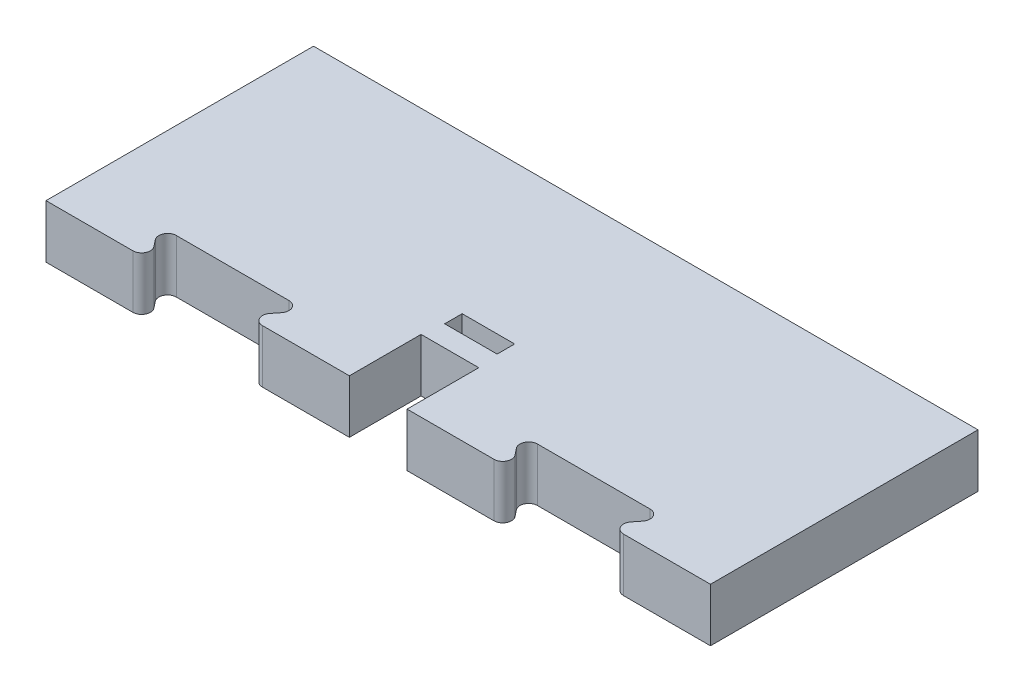
ISO-10303-21;
HEADER;
FILE_DESCRIPTION(('STEP AP214'),'2;1');
FILE_NAME('part.step','',(''),(''),'','','');
FILE_SCHEMA(('AUTOMOTIVE_DESIGN { 1 0 10303 214 1 1 1 1 }'));
ENDSEC;
DATA;
#1=APPLICATION_CONTEXT('core data for automotive mechanical design processes');
#2=APPLICATION_PROTOCOL_DEFINITION('international standard','automotive_design',2000,#1);
#3=PRODUCT_CONTEXT('',#1,'mechanical');
#4=PRODUCT('Part','Part','',(#3));
#5=PRODUCT_RELATED_PRODUCT_CATEGORY('part','',(#4));
#6=PRODUCT_DEFINITION_FORMATION('','',#4);
#7=PRODUCT_DEFINITION_CONTEXT('part definition',#1,'design');
#8=PRODUCT_DEFINITION('design','',#6,#7);
#9=PRODUCT_DEFINITION_SHAPE('','',#8);
#10=(LENGTH_UNIT() NAMED_UNIT(*) SI_UNIT(.MILLI.,.METRE.));
#11=(NAMED_UNIT(*) PLANE_ANGLE_UNIT() SI_UNIT($,.RADIAN.));
#12=(NAMED_UNIT(*) SI_UNIT($,.STERADIAN.) SOLID_ANGLE_UNIT());
#13=UNCERTAINTY_MEASURE_WITH_UNIT(LENGTH_MEASURE(1.E-05),#10,'distance_accuracy_value','');
#14=(GEOMETRIC_REPRESENTATION_CONTEXT(3) GLOBAL_UNCERTAINTY_ASSIGNED_CONTEXT((#13)) GLOBAL_UNIT_ASSIGNED_CONTEXT((#10,
#11,#12)) REPRESENTATION_CONTEXT('',''));
#15=CARTESIAN_POINT('',(0.,0.,0.));
#16=DIRECTION('',(0.,0.,1.));
#17=DIRECTION('',(1.,0.,0.));
#18=AXIS2_PLACEMENT_3D('',#15,#16,#17);
#19=CARTESIAN_POINT('',(0.,3.05,0.));
#20=DIRECTION('',(0.,0.,-1.));
#21=DIRECTION('',(-1.,0.,0.));
#22=AXIS2_PLACEMENT_3D('',#19,#20,#21);
#23=PLANE('',#22);
#24=DIRECTION('',(1.,0.,0.));
#25=VECTOR('',#24,1.);
#26=CARTESIAN_POINT('',(0.,3.05,0.));
#27=LINE('',#26,#25);
#28=CARTESIAN_POINT('',(12.3801767927264,3.05,0.));
#29=VERTEX_POINT('',#28);
#30=CARTESIAN_POINT('',(17.35,3.05,0.));
#31=VERTEX_POINT('',#30);
#32=EDGE_CURVE('E360',#29,#31,#27,.T.);
#33=ORIENTED_EDGE('',*,*,#32,.F.);
#34=DIRECTION('',(0.,1.,0.));
#35=VECTOR('',#34,1.);
#36=CARTESIAN_POINT('',(12.3801767927264,0.,0.));
#37=LINE('',#36,#35);
#38=CARTESIAN_POINT('',(12.3801767927264,0.,0.));
#39=VERTEX_POINT('',#38);
#40=EDGE_CURVE('E421',#29,#39,#37,.F.);
#41=ORIENTED_EDGE('',*,*,#40,.T.);
#42=DIRECTION('',(1.,0.,0.));
#43=VECTOR('',#42,1.);
#44=CARTESIAN_POINT('',(0.,0.,0.));
#45=LINE('',#44,#43);
#46=CARTESIAN_POINT('',(17.35,0.,0.));
#47=VERTEX_POINT('',#46);
#48=EDGE_CURVE('E365',#39,#47,#45,.T.);
#49=ORIENTED_EDGE('',*,*,#48,.T.);
#50=DIRECTION('',(0.,1.,0.));
#51=VECTOR('',#50,1.);
#52=CARTESIAN_POINT('',(17.35,0.,0.));
#53=LINE('',#52,#51);
#54=EDGE_CURVE('E315',#47,#31,#53,.T.);
#55=ORIENTED_EDGE('',*,*,#54,.T.);
#56=EDGE_LOOP('',(#33,#41,#49,#55));
#57=FACE_BOUND('',#56,.T.);
#58=ADVANCED_FACE('F41',(#57),#23,.F.);
#59=CARTESIAN_POINT('',(0.,0.,0.));
#60=VERTEX_POINT('',#59);
#61=CARTESIAN_POINT('',(4.96982320727361,0.,0.));
#62=VERTEX_POINT('',#61);
#63=EDGE_CURVE('E238',#60,#62,#45,.T.);
#64=ORIENTED_EDGE('',*,*,#63,.T.);
#65=DIRECTION('',(0.,1.,0.));
#66=VECTOR('',#65,1.);
#67=CARTESIAN_POINT('',(4.96982320727361,3.05,0.));
#68=LINE('',#67,#66);
#69=CARTESIAN_POINT('',(4.96982320727361,3.05,0.));
#70=VERTEX_POINT('',#69);
#71=EDGE_CURVE('E423',#62,#70,#68,.T.);
#72=ORIENTED_EDGE('',*,*,#71,.T.);
#73=CARTESIAN_POINT('',(0.,3.05,0.));
#74=VERTEX_POINT('',#73);
#75=EDGE_CURVE('E356',#74,#70,#27,.T.);
#76=ORIENTED_EDGE('',*,*,#75,.F.);
#77=DIRECTION('',(0.,-1.,0.));
#78=VECTOR('',#77,1.);
#79=CARTESIAN_POINT('',(0.,3.05,0.));
#80=LINE('',#79,#78);
#81=EDGE_CURVE('E369',#74,#60,#80,.T.);
#82=ORIENTED_EDGE('',*,*,#81,.T.);
#83=EDGE_LOOP('',(#64,#72,#76,#82));
#84=FACE_BOUND('',#83,.T.);
#85=ADVANCED_FACE('F456',(#84),#23,.F.);
#86=CARTESIAN_POINT('',(33.0301767927264,3.05,0.));
#87=VERTEX_POINT('',#86);
#88=CARTESIAN_POINT('',(38.,3.05,0.));
#89=VERTEX_POINT('',#88);
#90=EDGE_CURVE('E355',#87,#89,#27,.T.);
#91=ORIENTED_EDGE('',*,*,#90,.F.);
#92=DIRECTION('',(0.,1.,0.));
#93=VECTOR('',#92,1.);
#94=CARTESIAN_POINT('',(33.0301767927264,0.,0.));
#95=LINE('',#94,#93);
#96=CARTESIAN_POINT('',(33.0301767927264,0.,0.));
#97=VERTEX_POINT('',#96);
#98=EDGE_CURVE('E410',#87,#97,#95,.F.);
#99=ORIENTED_EDGE('',*,*,#98,.T.);
#100=CARTESIAN_POINT('',(38.,0.,0.));
#101=VERTEX_POINT('',#100);
#102=EDGE_CURVE('E364',#97,#101,#45,.T.);
#103=ORIENTED_EDGE('',*,*,#102,.T.);
#104=DIRECTION('',(0.,-1.,0.));
#105=VECTOR('',#104,1.);
#106=CARTESIAN_POINT('',(38.,3.05,0.));
#107=LINE('',#106,#105);
#108=EDGE_CURVE('E235',#89,#101,#107,.T.);
#109=ORIENTED_EDGE('',*,*,#108,.F.);
#110=EDGE_LOOP('',(#91,#99,#103,#109));
#111=FACE_BOUND('',#110,.T.);
#112=ADVANCED_FACE('F478',(#111),#23,.F.);
#113=CARTESIAN_POINT('',(20.65,0.,0.));
#114=VERTEX_POINT('',#113);
#115=CARTESIAN_POINT('',(25.6198232072736,0.,0.));
#116=VERTEX_POINT('',#115);
#117=EDGE_CURVE('E366',#114,#116,#45,.T.);
#118=ORIENTED_EDGE('',*,*,#117,.T.);
#119=DIRECTION('',(0.,1.,0.));
#120=VECTOR('',#119,1.);
#121=CARTESIAN_POINT('',(25.6198232072736,3.05,0.));
#122=LINE('',#121,#120);
#123=CARTESIAN_POINT('',(25.6198232072736,3.05,0.));
#124=VERTEX_POINT('',#123);
#125=EDGE_CURVE('E418',#116,#124,#122,.T.);
#126=ORIENTED_EDGE('',*,*,#125,.T.);
#127=CARTESIAN_POINT('',(20.65,3.05,0.));
#128=VERTEX_POINT('',#127);
#129=EDGE_CURVE('E361',#128,#124,#27,.T.);
#130=ORIENTED_EDGE('',*,*,#129,.F.);
#131=DIRECTION('',(0.,1.,0.));
#132=VECTOR('',#131,1.);
#133=CARTESIAN_POINT('',(20.65,0.,0.));
#134=LINE('',#133,#132);
#135=EDGE_CURVE('E305',#114,#128,#134,.T.);
#136=ORIENTED_EDGE('',*,*,#135,.F.);
#137=EDGE_LOOP('',(#118,#126,#130,#136));
#138=FACE_BOUND('',#137,.T.);
#139=ADVANCED_FACE('F474',(#138),#23,.F.);
#140=CARTESIAN_POINT('',(0.,3.05,0.));
#141=DIRECTION('',(0.,-1.,0.));
#142=DIRECTION('',(0.,0.,-1.));
#143=AXIS2_PLACEMENT_3D('',#140,#141,#142);
#144=PLANE('',#143);
#145=DIRECTION('',(0.,0.,-1.));
#146=VECTOR('',#145,1.);
#147=CARTESIAN_POINT('',(20.5,3.05,0.));
#148=LINE('',#147,#146);
#149=CARTESIAN_POINT('',(20.5,3.05,-5.3));
#150=VERTEX_POINT('',#149);
#151=CARTESIAN_POINT('',(20.5,3.05,-6.3));
#152=VERTEX_POINT('',#151);
#153=EDGE_CURVE('E338',#150,#152,#148,.T.);
#154=ORIENTED_EDGE('',*,*,#153,.F.);
#155=DIRECTION('',(1.,0.,0.));
#156=VECTOR('',#155,1.);
#157=CARTESIAN_POINT('',(0.,3.05,-5.3));
#158=LINE('',#157,#156);
#159=CARTESIAN_POINT('',(17.5,3.05,-5.3));
#160=VERTEX_POINT('',#159);
#161=EDGE_CURVE('E269',#160,#150,#158,.T.);
#162=ORIENTED_EDGE('',*,*,#161,.F.);
#163=DIRECTION('',(0.,0.,1.));
#164=VECTOR('',#163,1.);
#165=CARTESIAN_POINT('',(17.5,3.05,0.));
#166=LINE('',#165,#164);
#167=CARTESIAN_POINT('',(17.5,3.05,-6.3));
#168=VERTEX_POINT('',#167);
#169=EDGE_CURVE('E327',#168,#160,#166,.T.);
#170=ORIENTED_EDGE('',*,*,#169,.F.);
#171=DIRECTION('',(-1.,0.,0.));
#172=VECTOR('',#171,1.);
#173=CARTESIAN_POINT('',(0.,3.05,-6.3));
#174=LINE('',#173,#172);
#175=EDGE_CURVE('E341',#152,#168,#174,.T.);
#176=ORIENTED_EDGE('',*,*,#175,.F.);
#177=EDGE_LOOP('',(#154,#162,#170,#176));
#178=FACE_BOUND('',#177,.T.);
#179=DIRECTION('',(-0.618688597809048,0.,0.785636314678156));
#180=VECTOR('',#179,1.);
#181=CARTESIAN_POINT('',(19.7511814061144,3.05,15.5540553573151));
#182=LINE('',#181,#180);
#183=CARTESIAN_POINT('',(32.9376413646127,3.05,-1.19065570109548));
#184=VERTEX_POINT('',#183);
#185=CARTESIAN_POINT('',(32.6373586353873,3.05,-0.809344298904524));
#186=VERTEX_POINT('',#185);
#187=EDGE_CURVE('E258',#184,#186,#182,.T.);
#188=ORIENTED_EDGE('',*,*,#187,.T.);
#189=CARTESIAN_POINT('',(33.0301767927264,3.05,-0.5));
#190=DIRECTION('',(0.,-1.,0.));
#191=DIRECTION('',(0.,0.,-1.));
#192=AXIS2_PLACEMENT_3D('',#189,#190,#191);
#193=CIRCLE('',#192,0.5);
#194=EDGE_CURVE('E408',#186,#87,#193,.F.);
#195=ORIENTED_EDGE('',*,*,#194,.T.);
#196=ORIENTED_EDGE('',*,*,#90,.T.);
#197=DIRECTION('',(0.,0.,-1.));
#198=VECTOR('',#197,1.);
#199=CARTESIAN_POINT('',(38.,3.05,0.));
#200=LINE('',#199,#198);
#201=CARTESIAN_POINT('',(38.,3.05,-15.3));
#202=VERTEX_POINT('',#201);
#203=EDGE_CURVE('E359',#89,#202,#200,.T.);
#204=ORIENTED_EDGE('',*,*,#203,.T.);
#205=DIRECTION('',(1.,0.,0.));
#206=VECTOR('',#205,1.);
#207=CARTESIAN_POINT('',(38.,3.05,-15.3));
#208=LINE('',#207,#206);
#209=CARTESIAN_POINT('',(0.,3.05,-15.3));
#210=VERTEX_POINT('',#209);
#211=EDGE_CURVE('E253',#210,#202,#208,.T.);
#212=ORIENTED_EDGE('',*,*,#211,.F.);
#213=DIRECTION('',(0.,0.,1.));
#214=VECTOR('',#213,1.);
#215=CARTESIAN_POINT('',(0.,3.05,0.));
#216=LINE('',#215,#214);
#217=EDGE_CURVE('E237',#210,#74,#216,.T.);
#218=ORIENTED_EDGE('',*,*,#217,.T.);
#219=ORIENTED_EDGE('',*,*,#75,.T.);
#220=CARTESIAN_POINT('',(4.96982320727361,3.05,-0.5));
#221=DIRECTION('',(0.,-1.,0.));
#222=DIRECTION('',(0.,0.,-1.));
#223=AXIS2_PLACEMENT_3D('',#220,#221,#222);
#224=CIRCLE('',#223,0.5);
#225=CARTESIAN_POINT('',(5.36264136461269,3.05,-0.809344298904524));
#226=VERTEX_POINT('',#225);
#227=EDGE_CURVE('E402',#70,#226,#224,.F.);
#228=ORIENTED_EDGE('',*,*,#227,.T.);
#229=DIRECTION('',(-0.618688597809048,0.,-0.785636314678156));
#230=VECTOR('',#229,1.);
#231=CARTESIAN_POINT('',(3.70334651364645,3.05,-2.91638537949658));
#232=LINE('',#231,#230);
#233=CARTESIAN_POINT('',(5.06235863538731,3.05,-1.19065570109548));
#234=VERTEX_POINT('',#233);
#235=EDGE_CURVE('E263',#226,#234,#232,.T.);
#236=ORIENTED_EDGE('',*,*,#235,.T.);
#237=CARTESIAN_POINT('',(5.45517679272639,3.05,-1.5));
#238=DIRECTION('',(0.,-1.,0.));
#239=DIRECTION('',(0.,0.,-1.));
#240=AXIS2_PLACEMENT_3D('',#237,#238,#239);
#241=CIRCLE('',#240,0.5);
#242=CARTESIAN_POINT('',(5.45517679272639,3.05,-2.));
#243=VERTEX_POINT('',#242);
#244=EDGE_CURVE('E49',#234,#243,#241,.T.);
#245=ORIENTED_EDGE('',*,*,#244,.T.);
#246=DIRECTION('',(1.,0.,0.));
#247=VECTOR('',#246,1.);
#248=CARTESIAN_POINT('',(0.,3.05,-2.));
#249=LINE('',#248,#247);
#250=CARTESIAN_POINT('',(11.8948232072736,3.05,-2.));
#251=VERTEX_POINT('',#250);
#252=EDGE_CURVE('E273',#243,#251,#249,.T.);
#253=ORIENTED_EDGE('',*,*,#252,.T.);
#254=CARTESIAN_POINT('',(11.8948232072736,3.05,-1.5));
#255=DIRECTION('',(0.,-1.,0.));
#256=DIRECTION('',(0.,0.,-1.));
#257=AXIS2_PLACEMENT_3D('',#254,#255,#256);
#258=CIRCLE('',#257,0.5);
#259=CARTESIAN_POINT('',(12.2876413646127,3.05,-1.19065570109548));
#260=VERTEX_POINT('',#259);
#261=EDGE_CURVE('E434',#251,#260,#258,.T.);
#262=ORIENTED_EDGE('',*,*,#261,.T.);
#263=DIRECTION('',(-0.618688597809048,0.,0.785636314678156));
#264=VECTOR('',#263,1.);
#265=CARTESIAN_POINT('',(7.00549715498119,3.05,5.51682900954769));
#266=LINE('',#265,#264);
#267=CARTESIAN_POINT('',(11.9873586353873,3.05,-0.809344298904527));
#268=VERTEX_POINT('',#267);
#269=EDGE_CURVE('E270',#260,#268,#266,.T.);
#270=ORIENTED_EDGE('',*,*,#269,.T.);
#271=CARTESIAN_POINT('',(12.3801767927264,3.05,-0.5));
#272=DIRECTION('',(0.,-1.,0.));
#273=DIRECTION('',(0.,0.,-1.));
#274=AXIS2_PLACEMENT_3D('',#271,#272,#273);
#275=CIRCLE('',#274,0.5);
#276=EDGE_CURVE('E404',#268,#29,#275,.F.);
#277=ORIENTED_EDGE('',*,*,#276,.T.);
#278=ORIENTED_EDGE('',*,*,#32,.T.);
#279=DIRECTION('',(0.,0.,1.));
#280=VECTOR('',#279,1.);
#281=CARTESIAN_POINT('',(17.35,3.05,0.));
#282=LINE('',#281,#280);
#283=CARTESIAN_POINT('',(17.35,3.05,-4.1));
#284=VERTEX_POINT('',#283);
#285=EDGE_CURVE('E299',#284,#31,#282,.T.);
#286=ORIENTED_EDGE('',*,*,#285,.F.);
#287=DIRECTION('',(-1.,0.,0.));
#288=VECTOR('',#287,1.);
#289=CARTESIAN_POINT('',(0.,3.05,-4.1));
#290=LINE('',#289,#288);
#291=CARTESIAN_POINT('',(20.65,3.05,-4.10000000000001));
#292=VERTEX_POINT('',#291);
#293=EDGE_CURVE('E309',#292,#284,#290,.T.);
#294=ORIENTED_EDGE('',*,*,#293,.F.);
#295=DIRECTION('',(0.,0.,-1.));
#296=VECTOR('',#295,1.);
#297=CARTESIAN_POINT('',(20.65,3.05,0.));
#298=LINE('',#297,#296);
#299=EDGE_CURVE('E306',#128,#292,#298,.T.);
#300=ORIENTED_EDGE('',*,*,#299,.F.);
#301=ORIENTED_EDGE('',*,*,#129,.T.);
#302=CARTESIAN_POINT('',(25.6198232072736,3.05,-0.5));
#303=DIRECTION('',(0.,-1.,0.));
#304=DIRECTION('',(0.,0.,-1.));
#305=AXIS2_PLACEMENT_3D('',#302,#303,#304);
#306=CIRCLE('',#305,0.5);
#307=CARTESIAN_POINT('',(26.0126413646127,3.05,-0.809344298904524));
#308=VERTEX_POINT('',#307);
#309=EDGE_CURVE('E406',#124,#308,#306,.F.);
#310=ORIENTED_EDGE('',*,*,#309,.T.);
#311=DIRECTION('',(-0.618688597809049,0.,-0.785636314678155));
#312=VECTOR('',#311,1.);
#313=CARTESIAN_POINT('',(16.4490307647796,3.05,-12.953611727264));
#314=LINE('',#313,#312);
#315=CARTESIAN_POINT('',(25.7123586353873,3.05,-1.19065570109547));
#316=VERTEX_POINT('',#315);
#317=EDGE_CURVE('E283',#308,#316,#314,.T.);
#318=ORIENTED_EDGE('',*,*,#317,.T.);
#319=CARTESIAN_POINT('',(26.1051767927264,3.05,-1.5));
#320=DIRECTION('',(0.,-1.,0.));
#321=DIRECTION('',(0.,0.,-1.));
#322=AXIS2_PLACEMENT_3D('',#319,#320,#321);
#323=CIRCLE('',#322,0.5);
#324=CARTESIAN_POINT('',(26.1051767927264,3.05,-2.));
#325=VERTEX_POINT('',#324);
#326=EDGE_CURVE('E426',#316,#325,#323,.T.);
#327=ORIENTED_EDGE('',*,*,#326,.T.);
#328=DIRECTION('',(1.,0.,0.));
#329=VECTOR('',#328,1.);
#330=CARTESIAN_POINT('',(0.,3.05,-2.));
#331=LINE('',#330,#329);
#332=CARTESIAN_POINT('',(32.5448232072736,3.05,-2.));
#333=VERTEX_POINT('',#332);
#334=EDGE_CURVE('E290',#325,#333,#331,.T.);
#335=ORIENTED_EDGE('',*,*,#334,.T.);
#336=CARTESIAN_POINT('',(32.5448232072736,3.05,-1.5));
#337=DIRECTION('',(0.,-1.,0.));
#338=DIRECTION('',(0.,0.,-1.));
#339=AXIS2_PLACEMENT_3D('',#336,#337,#338);
#340=CIRCLE('',#339,0.5);
#341=EDGE_CURVE('E430',#333,#184,#340,.T.);
#342=ORIENTED_EDGE('',*,*,#341,.T.);
#343=EDGE_LOOP('',(#188,#195,#196,#204,#212,#218,#219,#228,#236,#245,#253,#262,#270,#277,#278,
#286,#294,#300,#301,#310,#318,#327,#335,#342));
#344=FACE_BOUND('',#343,.T.);
#345=ADVANCED_FACE('F439',(#178,#344),#144,.F.);
#346=CARTESIAN_POINT('',(0.,0.,0.));
#347=DIRECTION('',(0.,-1.,0.));
#348=DIRECTION('',(0.,0.,-1.));
#349=AXIS2_PLACEMENT_3D('',#346,#347,#348);
#350=PLANE('',#349);
#351=DIRECTION('',(1.,0.,0.));
#352=VECTOR('',#351,1.);
#353=CARTESIAN_POINT('',(0.,0.,-5.3));
#354=LINE('',#353,#352);
#355=CARTESIAN_POINT('',(17.5,0.,-5.3));
#356=VERTEX_POINT('',#355);
#357=CARTESIAN_POINT('',(20.5,0.,-5.3));
#358=VERTEX_POINT('',#357);
#359=EDGE_CURVE('E323',#356,#358,#354,.T.);
#360=ORIENTED_EDGE('',*,*,#359,.T.);
#361=DIRECTION('',(0.,0.,-1.));
#362=VECTOR('',#361,1.);
#363=CARTESIAN_POINT('',(20.5,0.,0.));
#364=LINE('',#363,#362);
#365=CARTESIAN_POINT('',(20.5,0.,-6.3));
#366=VERTEX_POINT('',#365);
#367=EDGE_CURVE('E326',#358,#366,#364,.T.);
#368=ORIENTED_EDGE('',*,*,#367,.T.);
#369=DIRECTION('',(-1.,0.,0.));
#370=VECTOR('',#369,1.);
#371=CARTESIAN_POINT('',(0.,0.,-6.3));
#372=LINE('',#371,#370);
#373=CARTESIAN_POINT('',(17.5,0.,-6.3));
#374=VERTEX_POINT('',#373);
#375=EDGE_CURVE('E330',#366,#374,#372,.T.);
#376=ORIENTED_EDGE('',*,*,#375,.T.);
#377=DIRECTION('',(0.,0.,1.));
#378=VECTOR('',#377,1.);
#379=CARTESIAN_POINT('',(17.5,0.,0.));
#380=LINE('',#379,#378);
#381=EDGE_CURVE('E333',#374,#356,#380,.T.);
#382=ORIENTED_EDGE('',*,*,#381,.T.);
#383=EDGE_LOOP('',(#360,#368,#376,#382));
#384=FACE_BOUND('',#383,.T.);
#385=ORIENTED_EDGE('',*,*,#102,.F.);
#386=CARTESIAN_POINT('',(33.0301767927264,0.,-0.5));
#387=DIRECTION('',(0.,-1.,0.));
#388=DIRECTION('',(0.,0.,-1.));
#389=AXIS2_PLACEMENT_3D('',#386,#387,#388);
#390=CIRCLE('',#389,0.5);
#391=CARTESIAN_POINT('',(32.6373586353873,0.,-0.809344298904524));
#392=VERTEX_POINT('',#391);
#393=EDGE_CURVE('E416',#97,#392,#390,.T.);
#394=ORIENTED_EDGE('',*,*,#393,.T.);
#395=DIRECTION('',(-0.618688597809048,0.,0.785636314678156));
#396=VECTOR('',#395,1.);
#397=CARTESIAN_POINT('',(19.7511814061144,0.,15.5540553573151));
#398=LINE('',#397,#396);
#399=CARTESIAN_POINT('',(32.9376413646127,0.,-1.19065570109548));
#400=VERTEX_POINT('',#399);
#401=EDGE_CURVE('E279',#400,#392,#398,.T.);
#402=ORIENTED_EDGE('',*,*,#401,.F.);
#403=CARTESIAN_POINT('',(32.5448232072736,0.,-1.5));
#404=DIRECTION('',(0.,-1.,0.));
#405=DIRECTION('',(0.,0.,-1.));
#406=AXIS2_PLACEMENT_3D('',#403,#404,#405);
#407=CIRCLE('',#406,0.5);
#408=CARTESIAN_POINT('',(32.5448232072736,0.,-2.));
#409=VERTEX_POINT('',#408);
#410=EDGE_CURVE('E432',#400,#409,#407,.F.);
#411=ORIENTED_EDGE('',*,*,#410,.T.);
#412=DIRECTION('',(1.,0.,0.));
#413=VECTOR('',#412,1.);
#414=CARTESIAN_POINT('',(0.,0.,-2.));
#415=LINE('',#414,#413);
#416=CARTESIAN_POINT('',(26.1051767927264,0.,-2.));
#417=VERTEX_POINT('',#416);
#418=EDGE_CURVE('E282',#417,#409,#415,.T.);
#419=ORIENTED_EDGE('',*,*,#418,.F.);
#420=CARTESIAN_POINT('',(26.1051767927264,0.,-1.5));
#421=DIRECTION('',(0.,-1.,0.));
#422=DIRECTION('',(0.,0.,-1.));
#423=AXIS2_PLACEMENT_3D('',#420,#421,#422);
#424=CIRCLE('',#423,0.5);
#425=CARTESIAN_POINT('',(25.7123586353873,0.,-1.19065570109547));
#426=VERTEX_POINT('',#425);
#427=EDGE_CURVE('E428',#417,#426,#424,.F.);
#428=ORIENTED_EDGE('',*,*,#427,.T.);
#429=DIRECTION('',(-0.618688597809049,0.,-0.785636314678155));
#430=VECTOR('',#429,1.);
#431=CARTESIAN_POINT('',(16.4490307647796,0.,-12.953611727264));
#432=LINE('',#431,#430);
#433=CARTESIAN_POINT('',(26.0126413646127,0.,-0.809344298904524));
#434=VERTEX_POINT('',#433);
#435=EDGE_CURVE('E274',#434,#426,#432,.T.);
#436=ORIENTED_EDGE('',*,*,#435,.F.);
#437=CARTESIAN_POINT('',(25.6198232072736,0.,-0.5));
#438=DIRECTION('',(0.,-1.,0.));
#439=DIRECTION('',(0.,0.,-1.));
#440=AXIS2_PLACEMENT_3D('',#437,#438,#439);
#441=CIRCLE('',#440,0.5);
#442=EDGE_CURVE('E56',#434,#116,#441,.T.);
#443=ORIENTED_EDGE('',*,*,#442,.T.);
#444=ORIENTED_EDGE('',*,*,#117,.F.);
#445=DIRECTION('',(0.,0.,-1.));
#446=VECTOR('',#445,1.);
#447=CARTESIAN_POINT('',(20.65,0.,0.));
#448=LINE('',#447,#446);
#449=CARTESIAN_POINT('',(20.65,0.,-4.10000000000001));
#450=VERTEX_POINT('',#449);
#451=EDGE_CURVE('E295',#114,#450,#448,.T.);
#452=ORIENTED_EDGE('',*,*,#451,.T.);
#453=DIRECTION('',(-1.,0.,0.));
#454=VECTOR('',#453,1.);
#455=CARTESIAN_POINT('',(0.,0.,-4.1));
#456=LINE('',#455,#454);
#457=CARTESIAN_POINT('',(17.35,0.,-4.1));
#458=VERTEX_POINT('',#457);
#459=EDGE_CURVE('E298',#450,#458,#456,.T.);
#460=ORIENTED_EDGE('',*,*,#459,.T.);
#461=DIRECTION('',(0.,0.,1.));
#462=VECTOR('',#461,1.);
#463=CARTESIAN_POINT('',(17.35,0.,0.));
#464=LINE('',#463,#462);
#465=EDGE_CURVE('E302',#458,#47,#464,.T.);
#466=ORIENTED_EDGE('',*,*,#465,.T.);
#467=ORIENTED_EDGE('',*,*,#48,.F.);
#468=CARTESIAN_POINT('',(12.3801767927264,0.,-0.5));
#469=DIRECTION('',(0.,-1.,0.));
#470=DIRECTION('',(0.,0.,-1.));
#471=AXIS2_PLACEMENT_3D('',#468,#469,#470);
#472=CIRCLE('',#471,0.5);
#473=CARTESIAN_POINT('',(11.9873586353873,0.,-0.809344298904527));
#474=VERTEX_POINT('',#473);
#475=EDGE_CURVE('E413',#39,#474,#472,.T.);
#476=ORIENTED_EDGE('',*,*,#475,.T.);
#477=DIRECTION('',(-0.618688597809048,0.,0.785636314678156));
#478=VECTOR('',#477,1.);
#479=CARTESIAN_POINT('',(7.00549715498119,0.,5.51682900954769));
#480=LINE('',#479,#478);
#481=CARTESIAN_POINT('',(12.2876413646127,0.,-1.19065570109548));
#482=VERTEX_POINT('',#481);
#483=EDGE_CURVE('E259',#482,#474,#480,.T.);
#484=ORIENTED_EDGE('',*,*,#483,.F.);
#485=CARTESIAN_POINT('',(11.8948232072736,0.,-1.5));
#486=DIRECTION('',(0.,-1.,0.));
#487=DIRECTION('',(0.,0.,-1.));
#488=AXIS2_PLACEMENT_3D('',#485,#486,#487);
#489=CIRCLE('',#488,0.5);
#490=CARTESIAN_POINT('',(11.8948232072736,0.,-2.));
#491=VERTEX_POINT('',#490);
#492=EDGE_CURVE('E436',#482,#491,#489,.F.);
#493=ORIENTED_EDGE('',*,*,#492,.T.);
#494=DIRECTION('',(1.,0.,0.));
#495=VECTOR('',#494,1.);
#496=CARTESIAN_POINT('',(0.,0.,-2.));
#497=LINE('',#496,#495);
#498=CARTESIAN_POINT('',(5.45517679272639,0.,-2.));
#499=VERTEX_POINT('',#498);
#500=EDGE_CURVE('E262',#499,#491,#497,.T.);
#501=ORIENTED_EDGE('',*,*,#500,.F.);
#502=CARTESIAN_POINT('',(5.45517679272639,0.,-1.5));
#503=DIRECTION('',(0.,-1.,0.));
#504=DIRECTION('',(0.,0.,-1.));
#505=AXIS2_PLACEMENT_3D('',#502,#503,#504);
#506=CIRCLE('',#505,0.5);
#507=CARTESIAN_POINT('',(5.06235863538731,0.,-1.19065570109548));
#508=VERTEX_POINT('',#507);
#509=EDGE_CURVE('E11',#499,#508,#506,.F.);
#510=ORIENTED_EDGE('',*,*,#509,.T.);
#511=DIRECTION('',(-0.618688597809048,0.,-0.785636314678156));
#512=VECTOR('',#511,1.);
#513=CARTESIAN_POINT('',(3.70334651364645,0.,-2.91638537949658));
#514=LINE('',#513,#512);
#515=CARTESIAN_POINT('',(5.36264136461269,0.,-0.809344298904524));
#516=VERTEX_POINT('',#515);
#517=EDGE_CURVE('E266',#516,#508,#514,.T.);
#518=ORIENTED_EDGE('',*,*,#517,.F.);
#519=CARTESIAN_POINT('',(4.96982320727361,0.,-0.5));
#520=DIRECTION('',(0.,-1.,0.));
#521=DIRECTION('',(0.,0.,-1.));
#522=AXIS2_PLACEMENT_3D('',#519,#520,#521);
#523=CIRCLE('',#522,0.5);
#524=EDGE_CURVE('E63',#516,#62,#523,.T.);
#525=ORIENTED_EDGE('',*,*,#524,.T.);
#526=ORIENTED_EDGE('',*,*,#63,.F.);
#527=DIRECTION('',(0.,0.,1.));
#528=VECTOR('',#527,1.);
#529=CARTESIAN_POINT('',(0.,0.,0.));
#530=LINE('',#529,#528);
#531=CARTESIAN_POINT('',(0.,0.,-15.3));
#532=VERTEX_POINT('',#531);
#533=EDGE_CURVE('E244',#532,#60,#530,.T.);
#534=ORIENTED_EDGE('',*,*,#533,.F.);
#535=DIRECTION('',(-1.,0.,0.));
#536=VECTOR('',#535,1.);
#537=CARTESIAN_POINT('',(38.,0.,-15.3));
#538=LINE('',#537,#536);
#539=CARTESIAN_POINT('',(38.,0.,-15.3));
#540=VERTEX_POINT('',#539);
#541=EDGE_CURVE('E241',#540,#532,#538,.T.);
#542=ORIENTED_EDGE('',*,*,#541,.F.);
#543=DIRECTION('',(0.,0.,-1.));
#544=VECTOR('',#543,1.);
#545=CARTESIAN_POINT('',(38.,0.,0.));
#546=LINE('',#545,#544);
#547=EDGE_CURVE('E228',#101,#540,#546,.T.);
#548=ORIENTED_EDGE('',*,*,#547,.F.);
#549=EDGE_LOOP('',(#385,#394,#402,#411,#419,#428,#436,#443,#444,#452,#460,#466,#467,#476,#484,
#493,#501,#510,#518,#525,#526,#534,#542,#548));
#550=FACE_BOUND('',#549,.T.);
#551=ADVANCED_FACE('F242',(#384,#550),#350,.T.);
#552=CARTESIAN_POINT('',(0.,3.05,0.));
#553=DIRECTION('',(1.,0.,0.));
#554=DIRECTION('',(0.,0.,-1.));
#555=AXIS2_PLACEMENT_3D('',#552,#553,#554);
#556=PLANE('',#555);
#557=ORIENTED_EDGE('',*,*,#533,.T.);
#558=ORIENTED_EDGE('',*,*,#81,.F.);
#559=ORIENTED_EDGE('',*,*,#217,.F.);
#560=DIRECTION('',(0.,1.,0.));
#561=VECTOR('',#560,1.);
#562=CARTESIAN_POINT('',(0.,3.05,-15.3));
#563=LINE('',#562,#561);
#564=EDGE_CURVE('E248',#532,#210,#563,.T.);
#565=ORIENTED_EDGE('',*,*,#564,.F.);
#566=EDGE_LOOP('',(#557,#558,#559,#565));
#567=FACE_BOUND('',#566,.T.);
#568=ADVANCED_FACE('F459',(#567),#556,.F.);
#569=CARTESIAN_POINT('',(38.,3.05,0.));
#570=DIRECTION('',(-1.,0.,0.));
#571=DIRECTION('',(0.,0.,1.));
#572=AXIS2_PLACEMENT_3D('',#569,#570,#571);
#573=PLANE('',#572);
#574=ORIENTED_EDGE('',*,*,#547,.T.);
#575=DIRECTION('',(0.,-1.,0.));
#576=VECTOR('',#575,1.);
#577=CARTESIAN_POINT('',(38.,3.05,-15.3));
#578=LINE('',#577,#576);
#579=EDGE_CURVE('E233',#202,#540,#578,.T.);
#580=ORIENTED_EDGE('',*,*,#579,.F.);
#581=ORIENTED_EDGE('',*,*,#203,.F.);
#582=ORIENTED_EDGE('',*,*,#108,.T.);
#583=EDGE_LOOP('',(#574,#580,#581,#582));
#584=FACE_BOUND('',#583,.T.);
#585=ADVANCED_FACE('F230',(#584),#573,.F.);
#586=CARTESIAN_POINT('',(0.,0.,-5.3));
#587=DIRECTION('',(0.,0.,1.));
#588=DIRECTION('',(1.,0.,0.));
#589=AXIS2_PLACEMENT_3D('',#586,#587,#588);
#590=PLANE('',#589);
#591=ORIENTED_EDGE('',*,*,#161,.T.);
#592=DIRECTION('',(0.,1.,0.));
#593=VECTOR('',#592,1.);
#594=CARTESIAN_POINT('',(20.5,0.,-5.3));
#595=LINE('',#594,#593);
#596=EDGE_CURVE('E336',#358,#150,#595,.T.);
#597=ORIENTED_EDGE('',*,*,#596,.F.);
#598=ORIENTED_EDGE('',*,*,#359,.F.);
#599=DIRECTION('',(0.,1.,0.));
#600=VECTOR('',#599,1.);
#601=CARTESIAN_POINT('',(17.5,0.,-5.3));
#602=LINE('',#601,#600);
#603=EDGE_CURVE('E310',#356,#160,#602,.T.);
#604=ORIENTED_EDGE('',*,*,#603,.T.);
#605=EDGE_LOOP('',(#591,#597,#598,#604));
#606=FACE_BOUND('',#605,.T.);
#607=ADVANCED_FACE('F466',(#606),#590,.F.);
#608=CARTESIAN_POINT('',(17.5,0.,0.));
#609=DIRECTION('',(-1.,0.,0.));
#610=DIRECTION('',(0.,0.,1.));
#611=AXIS2_PLACEMENT_3D('',#608,#609,#610);
#612=PLANE('',#611);
#613=ORIENTED_EDGE('',*,*,#169,.T.);
#614=ORIENTED_EDGE('',*,*,#603,.F.);
#615=ORIENTED_EDGE('',*,*,#381,.F.);
#616=DIRECTION('',(0.,1.,0.));
#617=VECTOR('',#616,1.);
#618=CARTESIAN_POINT('',(17.5,0.,-6.3));
#619=LINE('',#618,#617);
#620=EDGE_CURVE('E347',#374,#168,#619,.T.);
#621=ORIENTED_EDGE('',*,*,#620,.T.);
#622=EDGE_LOOP('',(#613,#614,#615,#621));
#623=FACE_BOUND('',#622,.T.);
#624=ADVANCED_FACE('F590',(#623),#612,.F.);
#625=CARTESIAN_POINT('',(0.,0.,-6.3));
#626=DIRECTION('',(0.,0.,-1.));
#627=DIRECTION('',(-1.,0.,0.));
#628=AXIS2_PLACEMENT_3D('',#625,#626,#627);
#629=PLANE('',#628);
#630=ORIENTED_EDGE('',*,*,#175,.T.);
#631=ORIENTED_EDGE('',*,*,#620,.F.);
#632=ORIENTED_EDGE('',*,*,#375,.F.);
#633=DIRECTION('',(0.,1.,0.));
#634=VECTOR('',#633,1.);
#635=CARTESIAN_POINT('',(20.5,0.,-6.3));
#636=LINE('',#635,#634);
#637=EDGE_CURVE('E349',#366,#152,#636,.T.);
#638=ORIENTED_EDGE('',*,*,#637,.T.);
#639=EDGE_LOOP('',(#630,#631,#632,#638));
#640=FACE_BOUND('',#639,.T.);
#641=ADVANCED_FACE('F593',(#640),#629,.F.);
#642=CARTESIAN_POINT('',(20.5,0.,0.));
#643=DIRECTION('',(1.,0.,0.));
#644=DIRECTION('',(0.,0.,-1.));
#645=AXIS2_PLACEMENT_3D('',#642,#643,#644);
#646=PLANE('',#645);
#647=ORIENTED_EDGE('',*,*,#153,.T.);
#648=ORIENTED_EDGE('',*,*,#637,.F.);
#649=ORIENTED_EDGE('',*,*,#367,.F.);
#650=ORIENTED_EDGE('',*,*,#596,.T.);
#651=EDGE_LOOP('',(#647,#648,#649,#650));
#652=FACE_BOUND('',#651,.T.);
#653=ADVANCED_FACE('F583',(#652),#646,.F.);
#654=CARTESIAN_POINT('',(17.35,0.,0.));
#655=DIRECTION('',(-1.,0.,0.));
#656=DIRECTION('',(0.,0.,1.));
#657=AXIS2_PLACEMENT_3D('',#654,#655,#656);
#658=PLANE('',#657);
#659=ORIENTED_EDGE('',*,*,#285,.T.);
#660=ORIENTED_EDGE('',*,*,#54,.F.);
#661=ORIENTED_EDGE('',*,*,#465,.F.);
#662=DIRECTION('',(0.,1.,0.));
#663=VECTOR('',#662,1.);
#664=CARTESIAN_POINT('',(17.35,0.,-4.1));
#665=LINE('',#664,#663);
#666=EDGE_CURVE('E318',#458,#284,#665,.T.);
#667=ORIENTED_EDGE('',*,*,#666,.T.);
#668=EDGE_LOOP('',(#659,#660,#661,#667));
#669=FACE_BOUND('',#668,.T.);
#670=ADVANCED_FACE('F529',(#669),#658,.F.);
#671=CARTESIAN_POINT('',(0.,0.,-4.1));
#672=DIRECTION('',(0.,0.,-1.));
#673=DIRECTION('',(-1.,0.,0.));
#674=AXIS2_PLACEMENT_3D('',#671,#672,#673);
#675=PLANE('',#674);
#676=ORIENTED_EDGE('',*,*,#293,.T.);
#677=ORIENTED_EDGE('',*,*,#666,.F.);
#678=ORIENTED_EDGE('',*,*,#459,.F.);
#679=DIRECTION('',(0.,1.,0.));
#680=VECTOR('',#679,1.);
#681=CARTESIAN_POINT('',(20.65,0.,-4.10000000000001));
#682=LINE('',#681,#680);
#683=EDGE_CURVE('E320',#450,#292,#682,.T.);
#684=ORIENTED_EDGE('',*,*,#683,.T.);
#685=EDGE_LOOP('',(#676,#677,#678,#684));
#686=FACE_BOUND('',#685,.T.);
#687=ADVANCED_FACE('F582',(#686),#675,.F.);
#688=CARTESIAN_POINT('',(20.65,0.,0.));
#689=DIRECTION('',(1.,0.,0.));
#690=DIRECTION('',(0.,0.,-1.));
#691=AXIS2_PLACEMENT_3D('',#688,#689,#690);
#692=PLANE('',#691);
#693=ORIENTED_EDGE('',*,*,#299,.T.);
#694=ORIENTED_EDGE('',*,*,#683,.F.);
#695=ORIENTED_EDGE('',*,*,#451,.F.);
#696=ORIENTED_EDGE('',*,*,#135,.T.);
#697=EDGE_LOOP('',(#693,#694,#695,#696));
#698=FACE_BOUND('',#697,.T.);
#699=ADVANCED_FACE('F579',(#698),#692,.F.);
#700=CARTESIAN_POINT('',(19.7511814061144,0.,15.5540553573151));
#701=DIRECTION('',(-0.785636314678156,0.,-0.618688597809048));
#702=DIRECTION('',(-0.618688597809048,0.,0.785636314678156));
#703=AXIS2_PLACEMENT_3D('',#700,#701,#702);
#704=PLANE('',#703);
#705=ORIENTED_EDGE('',*,*,#187,.F.);
#706=DIRECTION('',(0.,1.,0.));
#707=VECTOR('',#706,1.);
#708=CARTESIAN_POINT('',(32.9376413646127,0.,-1.19065570109548));
#709=LINE('',#708,#707);
#710=EDGE_CURVE('E385',#184,#400,#709,.F.);
#711=ORIENTED_EDGE('',*,*,#710,.T.);
#712=ORIENTED_EDGE('',*,*,#401,.T.);
#713=DIRECTION('',(0.,1.,0.));
#714=VECTOR('',#713,1.);
#715=CARTESIAN_POINT('',(32.6373586353873,3.05,-0.809344298904524));
#716=LINE('',#715,#714);
#717=EDGE_CURVE('E382',#392,#186,#716,.T.);
#718=ORIENTED_EDGE('',*,*,#717,.T.);
#719=EDGE_LOOP('',(#705,#711,#712,#718));
#720=FACE_BOUND('',#719,.T.);
#721=ADVANCED_FACE('F516',(#720),#704,.T.);
#722=CARTESIAN_POINT('',(16.4490307647796,0.,-12.953611727264));
#723=DIRECTION('',(0.785636314678155,0.,-0.618688597809049));
#724=DIRECTION('',(-0.618688597809049,0.,-0.785636314678155));
#725=AXIS2_PLACEMENT_3D('',#722,#723,#724);
#726=PLANE('',#725);
#727=ORIENTED_EDGE('',*,*,#435,.T.);
#728=DIRECTION('',(0.,1.,0.));
#729=VECTOR('',#728,1.);
#730=CARTESIAN_POINT('',(25.7123586353873,3.05,-1.19065570109548));
#731=LINE('',#730,#729);
#732=EDGE_CURVE('E374',#426,#316,#731,.T.);
#733=ORIENTED_EDGE('',*,*,#732,.T.);
#734=ORIENTED_EDGE('',*,*,#317,.F.);
#735=DIRECTION('',(0.,1.,0.));
#736=VECTOR('',#735,1.);
#737=CARTESIAN_POINT('',(26.0126413646127,0.,-0.809344298904527));
#738=LINE('',#737,#736);
#739=EDGE_CURVE('E372',#308,#434,#738,.F.);
#740=ORIENTED_EDGE('',*,*,#739,.T.);
#741=EDGE_LOOP('',(#727,#733,#734,#740));
#742=FACE_BOUND('',#741,.T.);
#743=ADVANCED_FACE('F499',(#742),#726,.T.);
#744=CARTESIAN_POINT('',(0.,0.,-2.));
#745=DIRECTION('',(0.,0.,1.));
#746=DIRECTION('',(1.,0.,0.));
#747=AXIS2_PLACEMENT_3D('',#744,#745,#746);
#748=PLANE('',#747);
#749=ORIENTED_EDGE('',*,*,#334,.F.);
#750=DIRECTION('',(0.,1.,0.));
#751=VECTOR('',#750,1.);
#752=CARTESIAN_POINT('',(26.1051767927264,0.,-2.));
#753=LINE('',#752,#751);
#754=EDGE_CURVE('E380',#325,#417,#753,.F.);
#755=ORIENTED_EDGE('',*,*,#754,.T.);
#756=ORIENTED_EDGE('',*,*,#418,.T.);
#757=DIRECTION('',(0.,1.,0.));
#758=VECTOR('',#757,1.);
#759=CARTESIAN_POINT('',(32.5448232072736,3.05,-2.));
#760=LINE('',#759,#758);
#761=EDGE_CURVE('E377',#409,#333,#760,.T.);
#762=ORIENTED_EDGE('',*,*,#761,.T.);
#763=EDGE_LOOP('',(#749,#755,#756,#762));
#764=FACE_BOUND('',#763,.T.);
#765=ADVANCED_FACE('F507',(#764),#748,.T.);
#766=CARTESIAN_POINT('',(7.00549715498119,0.,5.51682900954769));
#767=DIRECTION('',(-0.785636314678156,0.,-0.618688597809048));
#768=DIRECTION('',(-0.618688597809048,0.,0.785636314678156));
#769=AXIS2_PLACEMENT_3D('',#766,#767,#768);
#770=PLANE('',#769);
#771=ORIENTED_EDGE('',*,*,#269,.F.);
#772=DIRECTION('',(0.,1.,0.));
#773=VECTOR('',#772,1.);
#774=CARTESIAN_POINT('',(12.2876413646127,0.,-1.19065570109548));
#775=LINE('',#774,#773);
#776=EDGE_CURVE('E395',#260,#482,#775,.F.);
#777=ORIENTED_EDGE('',*,*,#776,.T.);
#778=ORIENTED_EDGE('',*,*,#483,.T.);
#779=DIRECTION('',(0.,1.,0.));
#780=VECTOR('',#779,1.);
#781=CARTESIAN_POINT('',(11.9873586353873,3.05,-0.809344298904525));
#782=LINE('',#781,#780);
#783=EDGE_CURVE('E392',#474,#268,#782,.T.);
#784=ORIENTED_EDGE('',*,*,#783,.T.);
#785=EDGE_LOOP('',(#771,#777,#778,#784));
#786=FACE_BOUND('',#785,.T.);
#787=ADVANCED_FACE('F539',(#786),#770,.T.);
#788=CARTESIAN_POINT('',(3.70334651364645,0.,-2.91638537949658));
#789=DIRECTION('',(0.785636314678156,0.,-0.618688597809048));
#790=DIRECTION('',(-0.618688597809048,0.,-0.785636314678156));
#791=AXIS2_PLACEMENT_3D('',#788,#789,#790);
#792=PLANE('',#791);
#793=ORIENTED_EDGE('',*,*,#517,.T.);
#794=DIRECTION('',(0.,1.,0.));
#795=VECTOR('',#794,1.);
#796=CARTESIAN_POINT('',(5.06235863538731,3.05,-1.19065570109548));
#797=LINE('',#796,#795);
#798=EDGE_CURVE('E399',#508,#234,#797,.T.);
#799=ORIENTED_EDGE('',*,*,#798,.T.);
#800=ORIENTED_EDGE('',*,*,#235,.F.);
#801=DIRECTION('',(0.,1.,0.));
#802=VECTOR('',#801,1.);
#803=CARTESIAN_POINT('',(5.36264136461269,0.,-0.809344298904524));
#804=LINE('',#803,#802);
#805=EDGE_CURVE('E397',#226,#516,#804,.F.);
#806=ORIENTED_EDGE('',*,*,#805,.T.);
#807=EDGE_LOOP('',(#793,#799,#800,#806));
#808=FACE_BOUND('',#807,.T.);
#809=ADVANCED_FACE('F451',(#808),#792,.T.);
#810=CARTESIAN_POINT('',(0.,0.,-2.));
#811=DIRECTION('',(0.,0.,1.));
#812=DIRECTION('',(1.,0.,0.));
#813=AXIS2_PLACEMENT_3D('',#810,#811,#812);
#814=PLANE('',#813);
#815=ORIENTED_EDGE('',*,*,#500,.T.);
#816=DIRECTION('',(0.,1.,0.));
#817=VECTOR('',#816,1.);
#818=CARTESIAN_POINT('',(11.8948232072736,3.05,-2.));
#819=LINE('',#818,#817);
#820=EDGE_CURVE('E389',#491,#251,#819,.T.);
#821=ORIENTED_EDGE('',*,*,#820,.T.);
#822=ORIENTED_EDGE('',*,*,#252,.F.);
#823=DIRECTION('',(0.,1.,0.));
#824=VECTOR('',#823,1.);
#825=CARTESIAN_POINT('',(5.45517679272639,0.,-2.));
#826=LINE('',#825,#824);
#827=EDGE_CURVE('E387',#243,#499,#826,.F.);
#828=ORIENTED_EDGE('',*,*,#827,.T.);
#829=EDGE_LOOP('',(#815,#821,#822,#828));
#830=FACE_BOUND('',#829,.T.);
#831=ADVANCED_FACE('F445',(#830),#814,.T.);
#832=CARTESIAN_POINT('',(26.1051767927264,0.,-1.5));
#833=DIRECTION('',(0.,-1.,0.));
#834=DIRECTION('',(0.,0.,-1.));
#835=AXIS2_PLACEMENT_3D('',#832,#833,#834);
#836=CYLINDRICAL_SURFACE('',#835,0.5);
#837=ORIENTED_EDGE('',*,*,#427,.F.);
#838=ORIENTED_EDGE('',*,*,#754,.F.);
#839=ORIENTED_EDGE('',*,*,#326,.F.);
#840=ORIENTED_EDGE('',*,*,#732,.F.);
#841=EDGE_LOOP('',(#837,#838,#839,#840));
#842=FACE_BOUND('',#841,.T.);
#843=ADVANCED_FACE('F503',(#842),#836,.F.);
#844=CARTESIAN_POINT('',(32.5448232072736,0.,-1.5));
#845=DIRECTION('',(0.,-1.,0.));
#846=DIRECTION('',(0.,0.,-1.));
#847=AXIS2_PLACEMENT_3D('',#844,#845,#846);
#848=CYLINDRICAL_SURFACE('',#847,0.5);
#849=ORIENTED_EDGE('',*,*,#410,.F.);
#850=ORIENTED_EDGE('',*,*,#710,.F.);
#851=ORIENTED_EDGE('',*,*,#341,.F.);
#852=ORIENTED_EDGE('',*,*,#761,.F.);
#853=EDGE_LOOP('',(#849,#850,#851,#852));
#854=FACE_BOUND('',#853,.T.);
#855=ADVANCED_FACE('F512',(#854),#848,.F.);
#856=CARTESIAN_POINT('',(11.8948232072736,0.,-1.5));
#857=DIRECTION('',(0.,-1.,0.));
#858=DIRECTION('',(0.,0.,-1.));
#859=AXIS2_PLACEMENT_3D('',#856,#857,#858);
#860=CYLINDRICAL_SURFACE('',#859,0.5);
#861=ORIENTED_EDGE('',*,*,#492,.F.);
#862=ORIENTED_EDGE('',*,*,#776,.F.);
#863=ORIENTED_EDGE('',*,*,#261,.F.);
#864=ORIENTED_EDGE('',*,*,#820,.F.);
#865=EDGE_LOOP('',(#861,#862,#863,#864));
#866=FACE_BOUND('',#865,.T.);
#867=ADVANCED_FACE('F543',(#866),#860,.F.);
#868=CARTESIAN_POINT('',(5.45517679272639,0.,-1.5));
#869=DIRECTION('',(0.,-1.,0.));
#870=DIRECTION('',(0.,0.,-1.));
#871=AXIS2_PLACEMENT_3D('',#868,#869,#870);
#872=CYLINDRICAL_SURFACE('',#871,0.5);
#873=ORIENTED_EDGE('',*,*,#509,.F.);
#874=ORIENTED_EDGE('',*,*,#827,.F.);
#875=ORIENTED_EDGE('',*,*,#244,.F.);
#876=ORIENTED_EDGE('',*,*,#798,.F.);
#877=EDGE_LOOP('',(#873,#874,#875,#876));
#878=FACE_BOUND('',#877,.T.);
#879=ADVANCED_FACE('F449',(#878),#872,.F.);
#880=CARTESIAN_POINT('',(33.0301767927264,0.,-0.5));
#881=DIRECTION('',(0.,-1.,0.));
#882=DIRECTION('',(0.,0.,-1.));
#883=AXIS2_PLACEMENT_3D('',#880,#881,#882);
#884=CYLINDRICAL_SURFACE('',#883,0.5);
#885=ORIENTED_EDGE('',*,*,#393,.F.);
#886=ORIENTED_EDGE('',*,*,#98,.F.);
#887=ORIENTED_EDGE('',*,*,#194,.F.);
#888=ORIENTED_EDGE('',*,*,#717,.F.);
#889=EDGE_LOOP('',(#885,#886,#887,#888));
#890=FACE_BOUND('',#889,.T.);
#891=ADVANCED_FACE('F521',(#890),#884,.T.);
#892=CARTESIAN_POINT('',(25.6198232072736,3.05,-0.5));
#893=DIRECTION('',(0.,-1.,0.));
#894=DIRECTION('',(0.,0.,-1.));
#895=AXIS2_PLACEMENT_3D('',#892,#893,#894);
#896=CYLINDRICAL_SURFACE('',#895,0.5);
#897=ORIENTED_EDGE('',*,*,#442,.F.);
#898=ORIENTED_EDGE('',*,*,#739,.F.);
#899=ORIENTED_EDGE('',*,*,#309,.F.);
#900=ORIENTED_EDGE('',*,*,#125,.F.);
#901=EDGE_LOOP('',(#897,#898,#899,#900));
#902=FACE_BOUND('',#901,.T.);
#903=ADVANCED_FACE('F494',(#902),#896,.T.);
#904=CARTESIAN_POINT('',(12.3801767927264,0.,-0.5));
#905=DIRECTION('',(0.,-1.,0.));
#906=DIRECTION('',(0.,0.,-1.));
#907=AXIS2_PLACEMENT_3D('',#904,#905,#906);
#908=CYLINDRICAL_SURFACE('',#907,0.5);
#909=ORIENTED_EDGE('',*,*,#475,.F.);
#910=ORIENTED_EDGE('',*,*,#40,.F.);
#911=ORIENTED_EDGE('',*,*,#276,.F.);
#912=ORIENTED_EDGE('',*,*,#783,.F.);
#913=EDGE_LOOP('',(#909,#910,#911,#912));
#914=FACE_BOUND('',#913,.T.);
#915=ADVANCED_FACE('F536',(#914),#908,.T.);
#916=CARTESIAN_POINT('',(4.96982320727361,3.05,-0.5));
#917=DIRECTION('',(0.,-1.,0.));
#918=DIRECTION('',(0.,0.,-1.));
#919=AXIS2_PLACEMENT_3D('',#916,#917,#918);
#920=CYLINDRICAL_SURFACE('',#919,0.5);
#921=ORIENTED_EDGE('',*,*,#524,.F.);
#922=ORIENTED_EDGE('',*,*,#805,.F.);
#923=ORIENTED_EDGE('',*,*,#227,.F.);
#924=ORIENTED_EDGE('',*,*,#71,.F.);
#925=EDGE_LOOP('',(#921,#922,#923,#924));
#926=FACE_BOUND('',#925,.T.);
#927=ADVANCED_FACE('F43',(#926),#920,.T.);
#928=CARTESIAN_POINT('',(0.,0.,-15.3));
#929=DIRECTION('',(0.,0.,-1.));
#930=DIRECTION('',(-1.,0.,0.));
#931=AXIS2_PLACEMENT_3D('',#928,#929,#930);
#932=PLANE('',#931);
#933=ORIENTED_EDGE('',*,*,#579,.T.);
#934=ORIENTED_EDGE('',*,*,#541,.T.);
#935=ORIENTED_EDGE('',*,*,#564,.T.);
#936=ORIENTED_EDGE('',*,*,#211,.T.);
#937=EDGE_LOOP('',(#933,#934,#935,#936));
#938=FACE_BOUND('',#937,.T.);
#939=ADVANCED_FACE('F251',(#938),#932,.T.);
#940=CLOSED_SHELL('',(#58,#85,#112,#139,#345,#551,#568,#585,#607,#624,#641,#653,#670,#687,#699,
#721,#743,#765,#787,#809,#831,#843,#855,#867,#879,#891,#903,#915,#927,#939));
#941=MANIFOLD_SOLID_BREP('B2',#940);
#942=ADVANCED_BREP_SHAPE_REPRESENTATION('',(#18,#941),#14);
#943=SHAPE_DEFINITION_REPRESENTATION(#9,#942);
ENDSEC;
END-ISO-10303-21;
